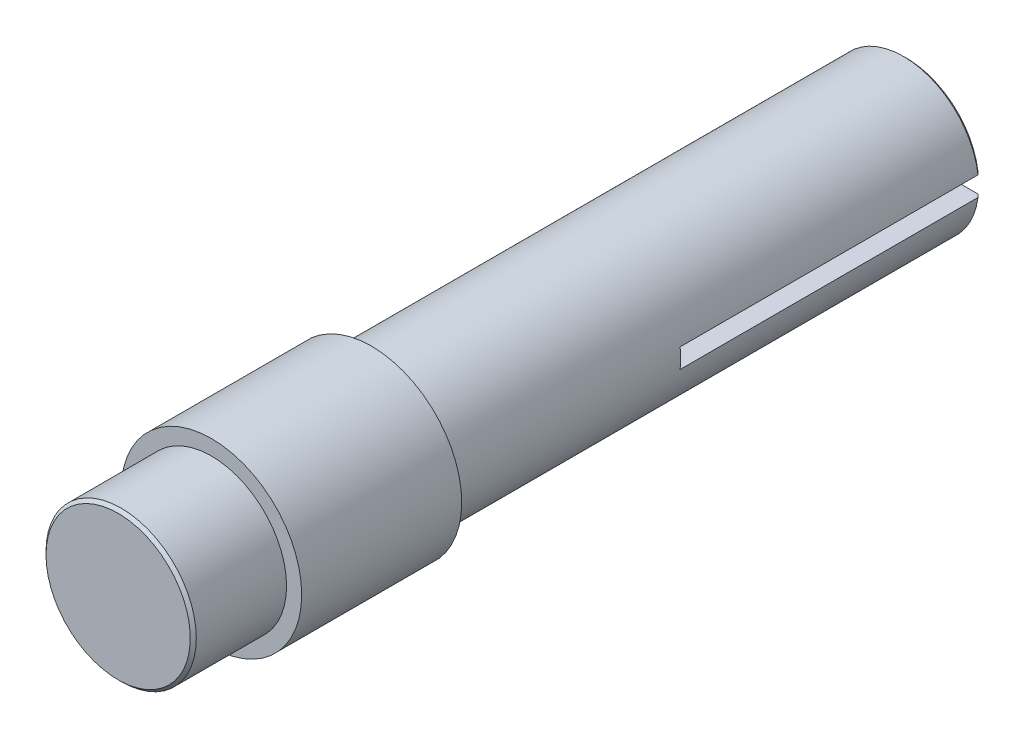
ISO-10303-21;
HEADER;
FILE_DESCRIPTION(('STEP AP214'),'2;1');
FILE_NAME('part.step','',(''),(''),'','','');
FILE_SCHEMA(('AUTOMOTIVE_DESIGN { 1 0 10303 214 1 1 1 1 }'));
ENDSEC;
DATA;
#1=APPLICATION_CONTEXT('core data for automotive mechanical design processes');
#2=APPLICATION_PROTOCOL_DEFINITION('international standard','automotive_design',2000,#1);
#3=PRODUCT_CONTEXT('',#1,'mechanical');
#4=PRODUCT('Part','Part','',(#3));
#5=PRODUCT_RELATED_PRODUCT_CATEGORY('part','',(#4));
#6=PRODUCT_DEFINITION_FORMATION('','',#4);
#7=PRODUCT_DEFINITION_CONTEXT('part definition',#1,'design');
#8=PRODUCT_DEFINITION('design','',#6,#7);
#9=PRODUCT_DEFINITION_SHAPE('','',#8);
#10=(LENGTH_UNIT() NAMED_UNIT(*) SI_UNIT(.MILLI.,.METRE.));
#11=(NAMED_UNIT(*) PLANE_ANGLE_UNIT() SI_UNIT($,.RADIAN.));
#12=(NAMED_UNIT(*) SI_UNIT($,.STERADIAN.) SOLID_ANGLE_UNIT());
#13=UNCERTAINTY_MEASURE_WITH_UNIT(LENGTH_MEASURE(1.E-05),#10,'distance_accuracy_value','');
#14=(GEOMETRIC_REPRESENTATION_CONTEXT(3) GLOBAL_UNCERTAINTY_ASSIGNED_CONTEXT((#13)) GLOBAL_UNIT_ASSIGNED_CONTEXT((#10,
#11,#12)) REPRESENTATION_CONTEXT('',''));
#15=CARTESIAN_POINT('',(0.,0.,0.));
#16=DIRECTION('',(0.,0.,1.));
#17=DIRECTION('',(1.,0.,0.));
#18=AXIS2_PLACEMENT_3D('',#15,#16,#17);
#19=CARTESIAN_POINT('',(0.,0.,66.548));
#20=DIRECTION('',(0.,0.,1.));
#21=DIRECTION('',(1.,0.,0.));
#22=AXIS2_PLACEMENT_3D('',#19,#20,#21);
#23=PLANE('',#22);
#24=CARTESIAN_POINT('',(0.,0.,66.5480000000116));
#25=DIRECTION('',(0.,0.,-1.));
#26=DIRECTION('',(-1.,0.,0.));
#27=AXIS2_PLACEMENT_3D('',#24,#25,#26);
#28=CIRCLE('',#27,6.08965000003536);
#29=CARTESIAN_POINT('',(-6.08965000003536,0.,66.5480000000116));
#30=VERTEX_POINT('',#29);
#31=EDGE_CURVE('E20',#30,#30,#28,.T.);
#32=ORIENTED_EDGE('',*,*,#31,.F.);
#33=EDGE_LOOP('',(#32));
#34=FACE_BOUND('',#33,.T.);
#35=ADVANCED_FACE('F17',(#34),#23,.T.);
#36=CARTESIAN_POINT('',(0.,0.,66.2939999999708));
#37=DIRECTION('',(0.,0.,-1.));
#38=DIRECTION('',(-1.,0.,0.));
#39=AXIS2_PLACEMENT_3D('',#36,#37,#38);
#40=CONICAL_SURFACE('',#39,6.3436500000762,0.785398163397448);
#41=ORIENTED_EDGE('',*,*,#31,.T.);
#42=EDGE_LOOP('',(#41));
#43=FACE_BOUND('',#42,.T.);
#44=CARTESIAN_POINT('',(0.,0.,66.294));
#45=DIRECTION('',(0.,0.,1.));
#46=DIRECTION('',(1.,0.,0.));
#47=AXIS2_PLACEMENT_3D('',#44,#45,#46);
#48=CIRCLE('',#47,6.34365);
#49=CARTESIAN_POINT('',(6.34365,0.,66.294));
#50=VERTEX_POINT('',#49);
#51=EDGE_CURVE('E104',#50,#50,#48,.F.);
#52=ORIENTED_EDGE('',*,*,#51,.F.);
#53=EDGE_LOOP('',(#52));
#54=FACE_BOUND('',#53,.T.);
#55=ADVANCED_FACE('F253',(#43,#54),#40,.T.);
#56=CARTESIAN_POINT('',(0.,0.,58.674));
#57=DIRECTION('',(0.,0.,1.));
#58=DIRECTION('',(1.,0.,0.));
#59=AXIS2_PLACEMENT_3D('',#56,#57,#58);
#60=CYLINDRICAL_SURFACE('',#59,6.34365);
#61=CARTESIAN_POINT('',(0.,0.,58.674));
#62=DIRECTION('',(0.,0.,1.));
#63=DIRECTION('',(1.,0.,0.));
#64=AXIS2_PLACEMENT_3D('',#61,#62,#63);
#65=CIRCLE('',#64,6.34365);
#66=CARTESIAN_POINT('',(6.34365,0.,58.674));
#67=VERTEX_POINT('',#66);
#68=EDGE_CURVE('E112',#67,#67,#65,.F.);
#69=ORIENTED_EDGE('',*,*,#68,.F.);
#70=EDGE_LOOP('',(#69));
#71=FACE_BOUND('',#70,.T.);
#72=ORIENTED_EDGE('',*,*,#51,.T.);
#73=EDGE_LOOP('',(#72));
#74=FACE_BOUND('',#73,.T.);
#75=ADVANCED_FACE('F237',(#71,#74),#60,.T.);
#76=CARTESIAN_POINT('',(0.,0.,0.));
#77=DIRECTION('',(0.,0.,-1.));
#78=DIRECTION('',(-1.,0.,0.));
#79=AXIS2_PLACEMENT_3D('',#76,#77,#78);
#80=CONICAL_SURFACE('',#79,4.24180000004526,0.785398163397448);
#81=CARTESIAN_POINT('',(0.,0.,0.));
#82=DIRECTION('',(0.,0.,-1.));
#83=DIRECTION('',(-1.,0.,0.));
#84=AXIS2_PLACEMENT_3D('',#81,#82,#83);
#85=CIRCLE('',#84,4.24180000004526);
#86=CARTESIAN_POINT('',(-4.16069909875042,0.825500000000004,4.87495990950969E-12));
#87=VERTEX_POINT('',#86);
#88=CARTESIAN_POINT('',(4.16069909875043,0.825500000000002,4.87477029973166E-12));
#89=VERTEX_POINT('',#88);
#90=EDGE_CURVE('E106',#87,#89,#85,.T.);
#91=ORIENTED_EDGE('',*,*,#90,.T.);
#92=CARTESIAN_POINT('',(3.90142263671804,0.825499999993357,0.254000000000132));
#93=CARTESIAN_POINT('',(3.94466279895481,0.82549999999668,0.211694654532947));
#94=CARTESIAN_POINT('',(3.9878892519787,0.825499999998895,0.169375315064931));
#95=CARTESIAN_POINT('',(4.07431473932099,0.82550000000111,0.0847086484012898));
#96=CARTESIAN_POINT('',(4.11751377363957,0.82550000000111,0.0423613212058465));
#97=CARTESIAN_POINT('',(4.16069909874545,0.825500000000002,9.75301194708369E-12));
#98=B_SPLINE_CURVE_WITH_KNOTS('',3,(#92,#93,#94,#95,#96,#97),.UNSPECIFIED.,.F.,.F.,(4,2,4),(0.,
0.181480231998764,0.362960462822674),.UNSPECIFIED.);
#99=CARTESIAN_POINT('',(3.90142263670108,0.825500000000002,0.254000000002121));
#100=VERTEX_POINT('',#99);
#101=EDGE_CURVE('E92',#100,#89,#98,.T.);
#102=ORIENTED_EDGE('',*,*,#101,.F.);
#103=CARTESIAN_POINT('',(0.,0.,0.254000000000011));
#104=DIRECTION('',(0.,0.,-1.));
#105=DIRECTION('',(-1.,0.,0.));
#106=AXIS2_PLACEMENT_3D('',#103,#104,#105);
#107=CIRCLE('',#106,3.9878);
#108=CARTESIAN_POINT('',(-3.90142263670108,0.825500000000004,0.254000000002121));
#109=VERTEX_POINT('',#108);
#110=EDGE_CURVE('E111',#100,#109,#107,.F.);
#111=ORIENTED_EDGE('',*,*,#110,.T.);
#112=CARTESIAN_POINT('',(-4.16069909874255,0.825499999995244,6.79130559682885E-12));
#113=CARTESIAN_POINT('',(-4.11751377363745,0.825499999997624,0.0423613212036816));
#114=CARTESIAN_POINT('',(-4.07431473931984,0.825499999999211,0.0847086484001116));
#115=CARTESIAN_POINT('',(-3.98788925197985,0.825500000000797,0.169375315066104));
#116=CARTESIAN_POINT('',(-3.9446627989573,0.825500000000797,0.211694654535486));
#117=CARTESIAN_POINT('',(-3.90142263672205,0.825500000000004,0.254000000004226));
#118=B_SPLINE_CURVE_WITH_KNOTS('',3,(#112,#113,#114,#115,#116,#117),.UNSPECIFIED.,.F.,.F.,(4,2,
4),(0.,0.181480230823911,0.362960462822673),.UNSPECIFIED.);
#119=EDGE_CURVE('E103',#87,#109,#118,.T.);
#120=ORIENTED_EDGE('',*,*,#119,.F.);
#121=EDGE_LOOP('',(#91,#102,#111,#120));
#122=FACE_BOUND('',#121,.T.);
#123=ADVANCED_FACE('F107',(#122),#80,.F.);
#124=CARTESIAN_POINT('',(0.,0.,58.674));
#125=DIRECTION('',(0.,0.,1.));
#126=DIRECTION('',(1.,0.,0.));
#127=AXIS2_PLACEMENT_3D('',#124,#125,#126);
#128=PLANE('',#127);
#129=CARTESIAN_POINT('',(0.,0.,58.674));
#130=DIRECTION('',(0.,0.,-1.));
#131=DIRECTION('',(-1.,0.,0.));
#132=AXIS2_PLACEMENT_3D('',#129,#130,#131);
#133=CIRCLE('',#132,7.62);
#134=CARTESIAN_POINT('',(-7.62,0.,58.674));
#135=VERTEX_POINT('',#134);
#136=EDGE_CURVE('E117',#135,#135,#133,.T.);
#137=ORIENTED_EDGE('',*,*,#136,.F.);
#138=EDGE_LOOP('',(#137));
#139=FACE_BOUND('',#138,.T.);
#140=ORIENTED_EDGE('',*,*,#68,.T.);
#141=EDGE_LOOP('',(#140));
#142=FACE_BOUND('',#141,.T.);
#143=ADVANCED_FACE('F230',(#139,#142),#128,.T.);
#144=CARTESIAN_POINT('',(0.,0.,0.));
#145=DIRECTION('',(0.,0.,1.));
#146=DIRECTION('',(1.,0.,0.));
#147=AXIS2_PLACEMENT_3D('',#144,#145,#146);
#148=PLANE('',#147);
#149=ORIENTED_EDGE('',*,*,#90,.F.);
#150=DIRECTION('',(-1.,0.,0.));
#151=VECTOR('',#150,1.);
#152=CARTESIAN_POINT('',(12.7,0.8255,0.));
#153=LINE('',#152,#151);
#154=CARTESIAN_POINT('',(-6.03343905843858,0.825500000000004,2.8421709430404E-11));
#155=VERTEX_POINT('',#154);
#156=EDGE_CURVE('E298',#87,#155,#153,.T.);
#157=ORIENTED_EDGE('',*,*,#156,.T.);
#158=CARTESIAN_POINT('',(0.,0.,5.6843418860808E-11));
#159=DIRECTION('',(0.,0.,1.));
#160=DIRECTION('',(1.,0.,0.));
#161=AXIS2_PLACEMENT_3D('',#158,#159,#160);
#162=CIRCLE('',#161,6.08964999997852);
#163=CARTESIAN_POINT('',(6.03343905843858,0.825500000000002,2.8421709430404E-11));
#164=VERTEX_POINT('',#163);
#165=EDGE_CURVE('E115',#164,#155,#162,.T.);
#166=ORIENTED_EDGE('',*,*,#165,.F.);
#167=DIRECTION('',(-1.,0.,0.));
#168=VECTOR('',#167,1.);
#169=CARTESIAN_POINT('',(12.7,0.8255,0.));
#170=LINE('',#169,#168);
#171=EDGE_CURVE('E98',#164,#89,#170,.T.);
#172=ORIENTED_EDGE('',*,*,#171,.T.);
#173=EDGE_LOOP('',(#149,#157,#166,#172));
#174=FACE_BOUND('',#173,.T.);
#175=ADVANCED_FACE('F114',(#174),#148,.F.);
#176=CARTESIAN_POINT('',(0.,0.,33.02));
#177=DIRECTION('',(0.,0.,-1.));
#178=DIRECTION('',(-1.,0.,0.));
#179=AXIS2_PLACEMENT_3D('',#176,#177,#178);
#180=PLANE('',#179);
#181=CARTESIAN_POINT('',(0.,0.,33.02));
#182=DIRECTION('',(0.,0.,-1.));
#183=DIRECTION('',(-1.,0.,0.));
#184=AXIS2_PLACEMENT_3D('',#181,#182,#183);
#185=CIRCLE('',#184,3.9878);
#186=CARTESIAN_POINT('',(-3.9878,0.,33.02));
#187=VERTEX_POINT('',#186);
#188=EDGE_CURVE('E174',#187,#187,#185,.T.);
#189=ORIENTED_EDGE('',*,*,#188,.T.);
#190=EDGE_LOOP('',(#189));
#191=FACE_BOUND('',#190,.T.);
#192=ADVANCED_FACE('F222',(#191),#180,.T.);
#193=CARTESIAN_POINT('',(0.,0.,0.));
#194=DIRECTION('',(0.,0.,-1.));
#195=DIRECTION('',(-1.,0.,0.));
#196=AXIS2_PLACEMENT_3D('',#193,#194,#195);
#197=CONICAL_SURFACE('',#196,4.24180000004526,0.785398163397448);
#198=CARTESIAN_POINT('',(0.,0.,0.));
#199=DIRECTION('',(0.,0.,-1.));
#200=DIRECTION('',(-1.,0.,0.));
#201=AXIS2_PLACEMENT_3D('',#198,#199,#200);
#202=CIRCLE('',#201,4.24180000004526);
#203=CARTESIAN_POINT('',(4.16069909875043,-0.8255,4.87477321759573E-12));
#204=VERTEX_POINT('',#203);
#205=CARTESIAN_POINT('',(-4.16069909875043,-0.825499999999997,4.87498922888754E-12));
#206=VERTEX_POINT('',#205);
#207=EDGE_CURVE('E171',#204,#206,#202,.T.);
#208=ORIENTED_EDGE('',*,*,#207,.T.);
#209=CARTESIAN_POINT('',(-3.90142263671804,-0.825499999993352,0.254000000000132));
#210=CARTESIAN_POINT('',(-3.94466279895481,-0.825499999996674,0.211694654532947));
#211=CARTESIAN_POINT('',(-3.9878892519787,-0.82549999999889,0.169375315064931));
#212=CARTESIAN_POINT('',(-4.07431473932099,-0.825500000001105,0.08470864840129));
#213=CARTESIAN_POINT('',(-4.11751377363957,-0.825500000001105,0.0423613212058468));
#214=CARTESIAN_POINT('',(-4.16069909874545,-0.825499999999997,9.75341459417289E-12));
#215=B_SPLINE_CURVE_WITH_KNOTS('',3,(#209,#210,#211,#212,#213,#214),.UNSPECIFIED.,.F.,.F.,(4,2,
4),(0.,0.181480231998764,0.362960462822674),.UNSPECIFIED.);
#216=CARTESIAN_POINT('',(-3.90142263670108,-0.825499999999997,0.254000000002121));
#217=VERTEX_POINT('',#216);
#218=EDGE_CURVE('E213',#217,#206,#215,.T.);
#219=ORIENTED_EDGE('',*,*,#218,.F.);
#220=CARTESIAN_POINT('',(0.,0.,0.254000000000011));
#221=DIRECTION('',(0.,0.,-1.));
#222=DIRECTION('',(-1.,0.,0.));
#223=AXIS2_PLACEMENT_3D('',#220,#221,#222);
#224=CIRCLE('',#223,3.9878);
#225=CARTESIAN_POINT('',(3.90142263670108,-0.8255,0.254000000002121));
#226=VERTEX_POINT('',#225);
#227=EDGE_CURVE('E179',#217,#226,#224,.F.);
#228=ORIENTED_EDGE('',*,*,#227,.T.);
#229=CARTESIAN_POINT('',(4.16069909874255,-0.82549999999524,6.79104598740887E-12));
#230=CARTESIAN_POINT('',(4.11751377363746,-0.82549999999762,0.0423613212036813));
#231=CARTESIAN_POINT('',(4.07431473931984,-0.825499999999207,0.0847086484001113));
#232=CARTESIAN_POINT('',(3.98788925197986,-0.825500000000793,0.169375315066104));
#233=CARTESIAN_POINT('',(3.9446627989573,-0.825500000000793,0.211694654535486));
#234=CARTESIAN_POINT('',(3.90142263672205,-0.8255,0.254000000004226));
#235=B_SPLINE_CURVE_WITH_KNOTS('',3,(#229,#230,#231,#232,#233,#234),.UNSPECIFIED.,.F.,.F.,(4,2,
4),(0.,0.181480230823912,0.362960462822673),.UNSPECIFIED.);
#236=EDGE_CURVE('E122',#204,#226,#235,.T.);
#237=ORIENTED_EDGE('',*,*,#236,.F.);
#238=EDGE_LOOP('',(#208,#219,#228,#237));
#239=FACE_BOUND('',#238,.T.);
#240=ADVANCED_FACE('F217',(#239),#197,.F.);
#241=CARTESIAN_POINT('',(0.,0.,66.548));
#242=DIRECTION('',(0.,0.,-1.));
#243=DIRECTION('',(-1.,0.,0.));
#244=AXIS2_PLACEMENT_3D('',#241,#242,#243);
#245=CYLINDRICAL_SURFACE('',#244,7.62);
#246=CARTESIAN_POINT('',(0.,0.,45.1652));
#247=DIRECTION('',(0.,0.,-1.));
#248=DIRECTION('',(-1.,0.,0.));
#249=AXIS2_PLACEMENT_3D('',#246,#247,#248);
#250=CIRCLE('',#249,7.62);
#251=CARTESIAN_POINT('',(-7.62,0.,45.1652));
#252=VERTEX_POINT('',#251);
#253=EDGE_CURVE('E168',#252,#252,#250,.F.);
#254=ORIENTED_EDGE('',*,*,#253,.T.);
#255=EDGE_LOOP('',(#254));
#256=FACE_BOUND('',#255,.T.);
#257=ORIENTED_EDGE('',*,*,#136,.T.);
#258=EDGE_LOOP('',(#257));
#259=FACE_BOUND('',#258,.T.);
#260=ADVANCED_FACE('F221',(#256,#259),#245,.T.);
#261=CARTESIAN_POINT('',(12.7,0.8255,25.4));
#262=DIRECTION('',(0.,1.,0.));
#263=DIRECTION('',(-1.,0.,0.));
#264=AXIS2_PLACEMENT_3D('',#261,#262,#263);
#265=PLANE('',#264);
#266=ORIENTED_EDGE('',*,*,#101,.T.);
#267=ORIENTED_EDGE('',*,*,#171,.F.);
#268=CARTESIAN_POINT('',(6.28970945847405,0.825500000000002,0.254000000040326));
#269=CARTESIAN_POINT('',(6.24700548972475,0.825500000000002,0.211658832732578));
#270=CARTESIAN_POINT('',(6.20429763868597,0.825500000000002,0.169321582416483));
#271=CARTESIAN_POINT('',(6.11887417201476,0.825500000000002,0.0846549157530507));
#272=CARTESIAN_POINT('',(6.07615855638232,0.825500000000002,0.0423254994057167));
#273=CARTESIAN_POINT('',(6.0334390584604,0.825500000000002,5.00382272762752E-11));
#274=B_SPLINE_CURVE_WITH_KNOTS('',3,(#268,#269,#270,#271,#272,#273),.UNSPECIFIED.,.F.,.F.,(4,2,
4),(0.,0.180409616545533,0.36081923315306),.UNSPECIFIED.);
#275=CARTESIAN_POINT('',(6.28970945849321,0.825500000000001,0.254000000020165));
#276=VERTEX_POINT('',#275);
#277=EDGE_CURVE('E119',#276,#164,#274,.T.);
#278=ORIENTED_EDGE('',*,*,#277,.F.);
#279=DIRECTION('',(0.,0.,-1.));
#280=VECTOR('',#279,1.);
#281=CARTESIAN_POINT('',(6.28970945851237,0.825500000000001,69.257814690566));
#282=LINE('',#281,#280);
#283=CARTESIAN_POINT('',(6.28970945851237,0.825500000000002,25.4));
#284=VERTEX_POINT('',#283);
#285=EDGE_CURVE('E167',#284,#276,#282,.T.);
#286=ORIENTED_EDGE('',*,*,#285,.F.);
#287=DIRECTION('',(-1.,0.,0.));
#288=VECTOR('',#287,1.);
#289=CARTESIAN_POINT('',(0.,0.825500000000002,25.4));
#290=LINE('',#289,#288);
#291=CARTESIAN_POINT('',(3.90142263668011,0.825500000000002,25.4));
#292=VERTEX_POINT('',#291);
#293=EDGE_CURVE('E183',#292,#284,#290,.F.);
#294=ORIENTED_EDGE('',*,*,#293,.F.);
#295=DIRECTION('',(0.,0.,1.));
#296=VECTOR('',#295,1.);
#297=CARTESIAN_POINT('',(3.90142263668011,0.825500000000002,25.4));
#298=LINE('',#297,#296);
#299=EDGE_CURVE('E102',#100,#292,#298,.T.);
#300=ORIENTED_EDGE('',*,*,#299,.F.);
#301=EDGE_LOOP('',(#266,#267,#278,#286,#294,#300));
#302=FACE_BOUND('',#301,.T.);
#303=ADVANCED_FACE('F96',(#302),#265,.F.);
#304=CARTESIAN_POINT('',(0.,0.,0.254000000040833));
#305=DIRECTION('',(0.,0.,1.));
#306=DIRECTION('',(1.,0.,0.));
#307=AXIS2_PLACEMENT_3D('',#304,#305,#306);
#308=CONICAL_SURFACE('',#307,6.34364999996251,0.785398163397448);
#309=ORIENTED_EDGE('',*,*,#277,.T.);
#310=ORIENTED_EDGE('',*,*,#165,.T.);
#311=CARTESIAN_POINT('',(-6.03343905845333,0.825500000000004,4.30320534276524E-11));
#312=CARTESIAN_POINT('',(-6.07615855637629,0.825500000000005,0.0423254993997397));
#313=CARTESIAN_POINT('',(-6.11887417200976,0.825500000000005,0.0846549157481032));
#314=CARTESIAN_POINT('',(-6.20429763868306,0.825500000000005,0.169321582413595));
#315=CARTESIAN_POINT('',(-6.24700548972288,0.825500000000005,0.21165883273072));
#316=CARTESIAN_POINT('',(-6.28970945847321,0.825500000000005,0.254000000039499));
#317=B_SPLINE_CURVE_WITH_KNOTS('',3,(#311,#312,#313,#314,#315,#316),.UNSPECIFIED.,.F.,.F.,(4,2,
4),(0.,0.180409616611917,0.36081923316184),.UNSPECIFIED.);
#318=CARTESIAN_POINT('',(-6.28970945849279,0.825500000000005,0.254000000019751));
#319=VERTEX_POINT('',#318);
#320=EDGE_CURVE('E184',#155,#319,#317,.T.);
#321=ORIENTED_EDGE('',*,*,#320,.T.);
#322=CARTESIAN_POINT('',(0.,0.,0.254000000000004));
#323=DIRECTION('',(0.,0.,-1.));
#324=DIRECTION('',(-1.,0.,0.));
#325=AXIS2_PLACEMENT_3D('',#322,#323,#324);
#326=CIRCLE('',#325,6.34365);
#327=EDGE_CURVE('E307',#276,#319,#326,.F.);
#328=ORIENTED_EDGE('',*,*,#327,.F.);
#329=EDGE_LOOP('',(#309,#310,#321,#328));
#330=FACE_BOUND('',#329,.T.);
#331=ADVANCED_FACE('F196',(#330),#308,.T.);
#332=CARTESIAN_POINT('',(12.7,0.8255,25.4));
#333=DIRECTION('',(0.,1.,0.));
#334=DIRECTION('',(-1.,0.,0.));
#335=AXIS2_PLACEMENT_3D('',#332,#333,#334);
#336=PLANE('',#335);
#337=ORIENTED_EDGE('',*,*,#119,.T.);
#338=DIRECTION('',(0.,0.,1.));
#339=VECTOR('',#338,1.);
#340=CARTESIAN_POINT('',(-3.90142263668011,0.825500000000004,25.4));
#341=LINE('',#340,#339);
#342=CARTESIAN_POINT('',(-3.90142263668011,0.825500000000004,25.4));
#343=VERTEX_POINT('',#342);
#344=EDGE_CURVE('E191',#343,#109,#341,.F.);
#345=ORIENTED_EDGE('',*,*,#344,.F.);
#346=DIRECTION('',(-1.,0.,0.));
#347=VECTOR('',#346,1.);
#348=CARTESIAN_POINT('',(0.,0.825500000000005,25.4));
#349=LINE('',#348,#347);
#350=CARTESIAN_POINT('',(-6.28970945851237,0.825500000000005,25.4));
#351=VERTEX_POINT('',#350);
#352=EDGE_CURVE('E295',#351,#343,#349,.F.);
#353=ORIENTED_EDGE('',*,*,#352,.F.);
#354=DIRECTION('',(0.,0.,-1.));
#355=VECTOR('',#354,1.);
#356=CARTESIAN_POINT('',(-6.28970945851237,0.825500000000005,69.257814690566));
#357=LINE('',#356,#355);
#358=EDGE_CURVE('E165',#319,#351,#357,.F.);
#359=ORIENTED_EDGE('',*,*,#358,.F.);
#360=ORIENTED_EDGE('',*,*,#320,.F.);
#361=ORIENTED_EDGE('',*,*,#156,.F.);
#362=EDGE_LOOP('',(#337,#345,#353,#359,#360,#361));
#363=FACE_BOUND('',#362,.T.);
#364=ADVANCED_FACE('F193',(#363),#336,.F.);
#365=CARTESIAN_POINT('',(0.,0.,25.4));
#366=DIRECTION('',(0.,0.,-1.));
#367=DIRECTION('',(-1.,0.,0.));
#368=AXIS2_PLACEMENT_3D('',#365,#366,#367);
#369=PLANE('',#368);
#370=DIRECTION('',(1.,0.,0.));
#371=VECTOR('',#370,1.);
#372=CARTESIAN_POINT('',(12.7,-0.825500000000003,25.4));
#373=LINE('',#372,#371);
#374=CARTESIAN_POINT('',(-3.90142263668011,-0.825499999999997,25.4));
#375=VERTEX_POINT('',#374);
#376=CARTESIAN_POINT('',(-6.28970945851237,-0.825499999999996,25.4));
#377=VERTEX_POINT('',#376);
#378=EDGE_CURVE('E293',#375,#377,#373,.F.);
#379=ORIENTED_EDGE('',*,*,#378,.T.);
#380=CARTESIAN_POINT('',(0.,0.,25.4));
#381=DIRECTION('',(0.,0.,-1.));
#382=DIRECTION('',(-1.,0.,0.));
#383=AXIS2_PLACEMENT_3D('',#380,#381,#382);
#384=CIRCLE('',#383,6.34365);
#385=EDGE_CURVE('E162',#351,#377,#384,.F.);
#386=ORIENTED_EDGE('',*,*,#385,.F.);
#387=ORIENTED_EDGE('',*,*,#352,.T.);
#388=CARTESIAN_POINT('',(0.,0.,25.4));
#389=DIRECTION('',(0.,0.,-1.));
#390=DIRECTION('',(-1.,0.,0.));
#391=AXIS2_PLACEMENT_3D('',#388,#389,#390);
#392=CIRCLE('',#391,3.9878);
#393=EDGE_CURVE('E180',#343,#375,#392,.F.);
#394=ORIENTED_EDGE('',*,*,#393,.T.);
#395=EDGE_LOOP('',(#379,#386,#387,#394));
#396=FACE_BOUND('',#395,.T.);
#397=ADVANCED_FACE('F330',(#396),#369,.T.);
#398=CARTESIAN_POINT('',(0.,0.,25.4));
#399=DIRECTION('',(0.,0.,-1.));
#400=DIRECTION('',(-1.,0.,0.));
#401=AXIS2_PLACEMENT_3D('',#398,#399,#400);
#402=PLANE('',#401);
#403=CARTESIAN_POINT('',(0.,0.,25.4));
#404=DIRECTION('',(0.,0.,-1.));
#405=DIRECTION('',(-1.,0.,0.));
#406=AXIS2_PLACEMENT_3D('',#403,#404,#405);
#407=CIRCLE('',#406,6.34365);
#408=CARTESIAN_POINT('',(6.28970945851237,-0.8255,25.4));
#409=VERTEX_POINT('',#408);
#410=EDGE_CURVE('E35',#409,#284,#407,.F.);
#411=ORIENTED_EDGE('',*,*,#410,.F.);
#412=DIRECTION('',(1.,0.,0.));
#413=VECTOR('',#412,1.);
#414=CARTESIAN_POINT('',(12.7,-0.825500000000003,25.4));
#415=LINE('',#414,#413);
#416=CARTESIAN_POINT('',(3.90142263668011,-0.8255,25.4));
#417=VERTEX_POINT('',#416);
#418=EDGE_CURVE('E281',#409,#417,#415,.F.);
#419=ORIENTED_EDGE('',*,*,#418,.T.);
#420=CARTESIAN_POINT('',(0.,0.,25.4));
#421=DIRECTION('',(0.,0.,-1.));
#422=DIRECTION('',(-1.,0.,0.));
#423=AXIS2_PLACEMENT_3D('',#420,#421,#422);
#424=CIRCLE('',#423,3.9878);
#425=EDGE_CURVE('E177',#417,#292,#424,.F.);
#426=ORIENTED_EDGE('',*,*,#425,.T.);
#427=ORIENTED_EDGE('',*,*,#293,.T.);
#428=EDGE_LOOP('',(#411,#419,#426,#427));
#429=FACE_BOUND('',#428,.T.);
#430=ADVANCED_FACE('F344',(#429),#402,.T.);
#431=CARTESIAN_POINT('',(0.,0.,33.02));
#432=DIRECTION('',(0.,0.,-1.));
#433=DIRECTION('',(-1.,0.,0.));
#434=AXIS2_PLACEMENT_3D('',#431,#432,#433);
#435=CYLINDRICAL_SURFACE('',#434,3.9878);
#436=ORIENTED_EDGE('',*,*,#393,.F.);
#437=ORIENTED_EDGE('',*,*,#344,.T.);
#438=ORIENTED_EDGE('',*,*,#110,.F.);
#439=ORIENTED_EDGE('',*,*,#299,.T.);
#440=ORIENTED_EDGE('',*,*,#425,.F.);
#441=DIRECTION('',(0.,0.,1.));
#442=VECTOR('',#441,1.);
#443=CARTESIAN_POINT('',(3.90142263668011,-0.8255,25.4));
#444=LINE('',#443,#442);
#445=EDGE_CURVE('E283',#417,#226,#444,.F.);
#446=ORIENTED_EDGE('',*,*,#445,.T.);
#447=ORIENTED_EDGE('',*,*,#227,.F.);
#448=DIRECTION('',(0.,0.,1.));
#449=VECTOR('',#448,1.);
#450=CARTESIAN_POINT('',(-3.90142263668011,-0.825499999999997,25.4));
#451=LINE('',#450,#449);
#452=EDGE_CURVE('E164',#217,#375,#451,.T.);
#453=ORIENTED_EDGE('',*,*,#452,.T.);
#454=EDGE_LOOP('',(#436,#437,#438,#439,#440,#446,#447,#453));
#455=FACE_BOUND('',#454,.T.);
#456=ORIENTED_EDGE('',*,*,#188,.F.);
#457=EDGE_LOOP('',(#456));
#458=FACE_BOUND('',#457,.T.);
#459=ADVANCED_FACE('F336',(#455,#458),#435,.F.);
#460=CARTESIAN_POINT('',(0.,0.,0.));
#461=DIRECTION('',(0.,0.,1.));
#462=DIRECTION('',(1.,0.,0.));
#463=AXIS2_PLACEMENT_3D('',#460,#461,#462);
#464=PLANE('',#463);
#465=CARTESIAN_POINT('',(0.,0.,5.6843418860808E-11));
#466=DIRECTION('',(0.,0.,1.));
#467=DIRECTION('',(1.,0.,0.));
#468=AXIS2_PLACEMENT_3D('',#465,#466,#467);
#469=CIRCLE('',#468,6.08964999997852);
#470=CARTESIAN_POINT('',(-6.03343905843858,-0.825499999999996,2.8421709430404E-11));
#471=VERTEX_POINT('',#470);
#472=CARTESIAN_POINT('',(6.03343905843858,-0.825500000000001,2.8421709430404E-11));
#473=VERTEX_POINT('',#472);
#474=EDGE_CURVE('E141',#471,#473,#469,.T.);
#475=ORIENTED_EDGE('',*,*,#474,.F.);
#476=DIRECTION('',(1.,0.,0.));
#477=VECTOR('',#476,1.);
#478=CARTESIAN_POINT('',(12.7,-0.825500000000003,0.));
#479=LINE('',#478,#477);
#480=EDGE_CURVE('E161',#471,#206,#479,.T.);
#481=ORIENTED_EDGE('',*,*,#480,.T.);
#482=ORIENTED_EDGE('',*,*,#207,.F.);
#483=DIRECTION('',(1.,0.,0.));
#484=VECTOR('',#483,1.);
#485=CARTESIAN_POINT('',(12.7,-0.825500000000003,0.));
#486=LINE('',#485,#484);
#487=EDGE_CURVE('E140',#204,#473,#486,.T.);
#488=ORIENTED_EDGE('',*,*,#487,.T.);
#489=EDGE_LOOP('',(#475,#481,#482,#488));
#490=FACE_BOUND('',#489,.T.);
#491=ADVANCED_FACE('F342',(#490),#464,.F.);
#492=CARTESIAN_POINT('',(-33.0446261016883,-1.31548410846224,45.1652));
#493=DIRECTION('',(0.,0.,1.));
#494=DIRECTION('',(0.,-1.,0.));
#495=AXIS2_PLACEMENT_3D('',#492,#493,#494);
#496=PLANE('',#495);
#497=CARTESIAN_POINT('',(0.,0.,45.1652));
#498=DIRECTION('',(0.,0.,-1.));
#499=DIRECTION('',(-1.,0.,0.));
#500=AXIS2_PLACEMENT_3D('',#497,#498,#499);
#501=CIRCLE('',#500,6.34365);
#502=CARTESIAN_POINT('',(-6.34365,0.,45.1652));
#503=VERTEX_POINT('',#502);
#504=EDGE_CURVE('E129',#503,#503,#501,.T.);
#505=ORIENTED_EDGE('',*,*,#504,.F.);
#506=EDGE_LOOP('',(#505));
#507=FACE_BOUND('',#506,.T.);
#508=ORIENTED_EDGE('',*,*,#253,.F.);
#509=EDGE_LOOP('',(#508));
#510=FACE_BOUND('',#509,.T.);
#511=ADVANCED_FACE('F354',(#507,#510),#496,.F.);
#512=CARTESIAN_POINT('',(12.7,-0.825500000000003,25.4));
#513=DIRECTION('',(0.,-1.,0.));
#514=DIRECTION('',(1.,0.,0.));
#515=AXIS2_PLACEMENT_3D('',#512,#513,#514);
#516=PLANE('',#515);
#517=CARTESIAN_POINT('',(-6.28970945847532,-0.825499999999996,0.254000000041589));
#518=CARTESIAN_POINT('',(-6.24700548972582,-0.825499999999996,0.21165883273363));
#519=CARTESIAN_POINT('',(-6.20429763868682,-0.825499999999996,0.169321582417324));
#520=CARTESIAN_POINT('',(-6.11887417201518,-0.825499999999996,0.0846549157534709));
#521=CARTESIAN_POINT('',(-6.07615855638253,-0.825499999999996,0.0423254994059263));
#522=CARTESIAN_POINT('',(-6.0334390584604,-0.825499999999996,5.00370955880802E-11));
#523=B_SPLINE_CURVE_WITH_KNOTS('',3,(#517,#518,#519,#520,#521,#522),.UNSPECIFIED.,.F.,.F.,(4,2,
4),(0.,0.180409616546431,0.360819233154856),.UNSPECIFIED.);
#524=CARTESIAN_POINT('',(-6.28970945849385,-0.825499999999996,0.254000000020797));
#525=VERTEX_POINT('',#524);
#526=EDGE_CURVE('E155',#525,#471,#523,.T.);
#527=ORIENTED_EDGE('',*,*,#526,.F.);
#528=DIRECTION('',(0.,0.,-1.));
#529=VECTOR('',#528,1.);
#530=CARTESIAN_POINT('',(-6.28970945851237,-0.825499999999996,69.257814690566));
#531=LINE('',#530,#529);
#532=EDGE_CURVE('E132',#377,#525,#531,.T.);
#533=ORIENTED_EDGE('',*,*,#532,.F.);
#534=ORIENTED_EDGE('',*,*,#378,.F.);
#535=ORIENTED_EDGE('',*,*,#452,.F.);
#536=ORIENTED_EDGE('',*,*,#218,.T.);
#537=ORIENTED_EDGE('',*,*,#480,.F.);
#538=EDGE_LOOP('',(#527,#533,#534,#535,#536,#537));
#539=FACE_BOUND('',#538,.T.);
#540=ADVANCED_FACE('F150',(#539),#516,.F.);
#541=CARTESIAN_POINT('',(0.,0.,0.254000000040833));
#542=DIRECTION('',(0.,0.,1.));
#543=DIRECTION('',(1.,0.,0.));
#544=AXIS2_PLACEMENT_3D('',#541,#542,#543);
#545=CONICAL_SURFACE('',#544,6.34364999996251,0.785398163397448);
#546=ORIENTED_EDGE('',*,*,#526,.T.);
#547=ORIENTED_EDGE('',*,*,#474,.T.);
#548=CARTESIAN_POINT('',(6.03343905845579,-0.825500000000001,4.5471084232545E-11));
#549=CARTESIAN_POINT('',(6.07615855637884,-0.825500000000001,0.0423254994022626));
#550=CARTESIAN_POINT('',(6.1188741720124,-0.825500000000001,0.0846549157507099));
#551=CARTESIAN_POINT('',(6.20429763868586,-0.825500000000001,0.169321582416369));
#552=CARTESIAN_POINT('',(6.24700548972576,-0.825500000000001,0.211658832733578));
#553=CARTESIAN_POINT('',(6.28970945847618,-0.825500000000001,0.25400000004244));
#554=B_SPLINE_CURVE_WITH_KNOTS('',3,(#548,#549,#550,#551,#552,#553),.UNSPECIFIED.,.F.,.F.,(4,2,
4),(0.,0.180409616612272,0.360819233162551),.UNSPECIFIED.);
#555=CARTESIAN_POINT('',(6.28970945849428,-0.8255,0.254000000021222));
#556=VERTEX_POINT('',#555);
#557=EDGE_CURVE('E133',#473,#556,#554,.T.);
#558=ORIENTED_EDGE('',*,*,#557,.T.);
#559=CARTESIAN_POINT('',(0.,0.,0.254000000000004));
#560=DIRECTION('',(0.,0.,-1.));
#561=DIRECTION('',(-1.,0.,0.));
#562=AXIS2_PLACEMENT_3D('',#559,#560,#561);
#563=CIRCLE('',#562,6.34365);
#564=EDGE_CURVE('E26',#525,#556,#563,.F.);
#565=ORIENTED_EDGE('',*,*,#564,.F.);
#566=EDGE_LOOP('',(#546,#547,#558,#565));
#567=FACE_BOUND('',#566,.T.);
#568=ADVANCED_FACE('F146',(#567),#545,.T.);
#569=CARTESIAN_POINT('',(12.7,-0.825500000000003,25.4));
#570=DIRECTION('',(0.,-1.,0.));
#571=DIRECTION('',(1.,0.,0.));
#572=AXIS2_PLACEMENT_3D('',#569,#570,#571);
#573=PLANE('',#572);
#574=ORIENTED_EDGE('',*,*,#557,.F.);
#575=ORIENTED_EDGE('',*,*,#487,.F.);
#576=ORIENTED_EDGE('',*,*,#236,.T.);
#577=ORIENTED_EDGE('',*,*,#445,.F.);
#578=ORIENTED_EDGE('',*,*,#418,.F.);
#579=DIRECTION('',(0.,0.,-1.));
#580=VECTOR('',#579,1.);
#581=CARTESIAN_POINT('',(6.28970945851237,-0.825499999999999,69.257814690566));
#582=LINE('',#581,#580);
#583=EDGE_CURVE('E11',#556,#409,#582,.F.);
#584=ORIENTED_EDGE('',*,*,#583,.F.);
#585=EDGE_LOOP('',(#574,#575,#576,#577,#578,#584));
#586=FACE_BOUND('',#585,.T.);
#587=ADVANCED_FACE('F143',(#586),#573,.F.);
#588=CARTESIAN_POINT('',(0.,0.,69.257814690566));
#589=DIRECTION('',(0.,0.,-1.));
#590=DIRECTION('',(-1.,0.,0.));
#591=AXIS2_PLACEMENT_3D('',#588,#589,#590);
#592=CYLINDRICAL_SURFACE('',#591,6.34365);
#593=ORIENTED_EDGE('',*,*,#504,.T.);
#594=EDGE_LOOP('',(#593));
#595=FACE_BOUND('',#594,.T.);
#596=ORIENTED_EDGE('',*,*,#583,.T.);
#597=ORIENTED_EDGE('',*,*,#410,.T.);
#598=ORIENTED_EDGE('',*,*,#285,.T.);
#599=ORIENTED_EDGE('',*,*,#327,.T.);
#600=ORIENTED_EDGE('',*,*,#358,.T.);
#601=ORIENTED_EDGE('',*,*,#385,.T.);
#602=ORIENTED_EDGE('',*,*,#532,.T.);
#603=ORIENTED_EDGE('',*,*,#564,.T.);
#604=EDGE_LOOP('',(#596,#597,#598,#599,#600,#601,#602,#603));
#605=FACE_BOUND('',#604,.T.);
#606=ADVANCED_FACE('F264',(#595,#605),#592,.T.);
#607=CLOSED_SHELL('',(#35,#55,#75,#123,#143,#175,#192,#240,#260,#303,#331,#364,#397,#430,#459,
#491,#511,#540,#568,#587,#606));
#608=MANIFOLD_SOLID_BREP('B1',#607);
#609=ADVANCED_BREP_SHAPE_REPRESENTATION('',(#18,#608),#14);
#610=SHAPE_DEFINITION_REPRESENTATION(#9,#609);
ENDSEC;
END-ISO-10303-21;
